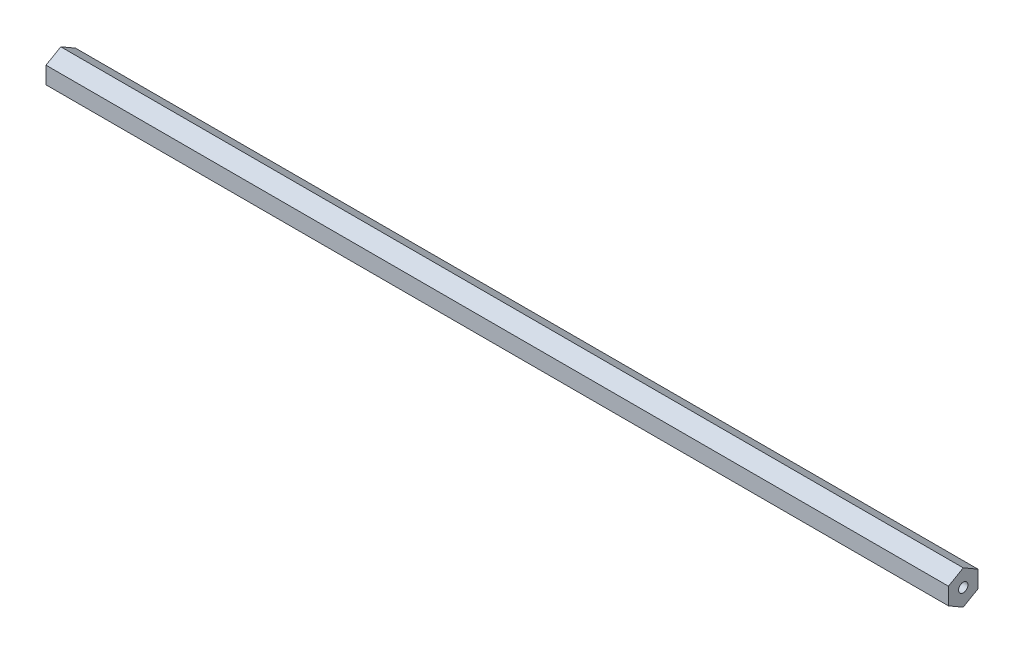
ISO-10303-21;
HEADER;
FILE_DESCRIPTION(('STEP AP214'),'2;1');
FILE_NAME('part.step','',(''),(''),'','','');
FILE_SCHEMA(('AUTOMOTIVE_DESIGN { 1 0 10303 214 1 1 1 1 }'));
ENDSEC;
DATA;
#1=APPLICATION_CONTEXT('core data for automotive mechanical design processes');
#2=APPLICATION_PROTOCOL_DEFINITION('international standard','automotive_design',2000,#1);
#3=PRODUCT_CONTEXT('',#1,'mechanical');
#4=PRODUCT('Part','Part','',(#3));
#5=PRODUCT_RELATED_PRODUCT_CATEGORY('part','',(#4));
#6=PRODUCT_DEFINITION_FORMATION('','',#4);
#7=PRODUCT_DEFINITION_CONTEXT('part definition',#1,'design');
#8=PRODUCT_DEFINITION('design','',#6,#7);
#9=PRODUCT_DEFINITION_SHAPE('','',#8);
#10=(LENGTH_UNIT() NAMED_UNIT(*) SI_UNIT(.MILLI.,.METRE.));
#11=(NAMED_UNIT(*) PLANE_ANGLE_UNIT() SI_UNIT($,.RADIAN.));
#12=(NAMED_UNIT(*) SI_UNIT($,.STERADIAN.) SOLID_ANGLE_UNIT());
#13=UNCERTAINTY_MEASURE_WITH_UNIT(LENGTH_MEASURE(1.E-05),#10,'distance_accuracy_value','');
#14=(GEOMETRIC_REPRESENTATION_CONTEXT(3) GLOBAL_UNCERTAINTY_ASSIGNED_CONTEXT((#13)) GLOBAL_UNIT_ASSIGNED_CONTEXT((#10,
#11,#12)) REPRESENTATION_CONTEXT('',''));
#15=CARTESIAN_POINT('',(0.,0.,0.));
#16=DIRECTION('',(0.,0.,1.));
#17=DIRECTION('',(1.,0.,0.));
#18=AXIS2_PLACEMENT_3D('',#15,#16,#17);
#19=CARTESIAN_POINT('',(194.071875,0.,-6.35));
#20=DIRECTION('',(0.,0.,1.));
#21=DIRECTION('',(0.,-1.,0.));
#22=AXIS2_PLACEMENT_3D('',#19,#20,#21);
#23=PLANE('',#22);
#24=DIRECTION('',(0.,1.,0.));
#25=VECTOR('',#24,1.);
#26=CARTESIAN_POINT('',(-194.071875,0.,-6.35));
#27=LINE('',#26,#25);
#28=CARTESIAN_POINT('',(-194.071875,-3.66617420935412,-6.35));
#29=VERTEX_POINT('',#28);
#30=CARTESIAN_POINT('',(-194.071875,3.66617420935413,-6.35));
#31=VERTEX_POINT('',#30);
#32=EDGE_CURVE('E134',#29,#31,#27,.T.);
#33=ORIENTED_EDGE('',*,*,#32,.T.);
#34=DIRECTION('',(-1.,0.,0.));
#35=VECTOR('',#34,1.);
#36=CARTESIAN_POINT('',(194.071875,3.66617420935413,-6.35));
#37=LINE('',#36,#35);
#38=CARTESIAN_POINT('',(194.071875,3.66617420935413,-6.35));
#39=VERTEX_POINT('',#38);
#40=EDGE_CURVE('E11',#39,#31,#37,.T.);
#41=ORIENTED_EDGE('',*,*,#40,.F.);
#42=DIRECTION('',(0.,1.,0.));
#43=VECTOR('',#42,1.);
#44=CARTESIAN_POINT('',(194.071875,0.,-6.35));
#45=LINE('',#44,#43);
#46=CARTESIAN_POINT('',(194.071875,-3.66617420935412,-6.35));
#47=VERTEX_POINT('',#46);
#48=EDGE_CURVE('E145',#47,#39,#45,.T.);
#49=ORIENTED_EDGE('',*,*,#48,.F.);
#50=DIRECTION('',(-1.,0.,0.));
#51=VECTOR('',#50,1.);
#52=CARTESIAN_POINT('',(194.071875,-3.66617420935412,-6.35));
#53=LINE('',#52,#51);
#54=EDGE_CURVE('E130',#47,#29,#53,.T.);
#55=ORIENTED_EDGE('',*,*,#54,.T.);
#56=EDGE_LOOP('',(#33,#41,#49,#55));
#57=FACE_BOUND('',#56,.T.);
#58=ADVANCED_FACE('F47',(#57),#23,.F.);
#59=CARTESIAN_POINT('',(194.071875,5.49926131403119,-3.175));
#60=DIRECTION('',(0.,-0.866025403784439,0.5));
#61=DIRECTION('',(0.,-0.5,-0.866025403784439));
#62=AXIS2_PLACEMENT_3D('',#59,#60,#61);
#63=PLANE('',#62);
#64=DIRECTION('',(0.,0.5,0.866025403784439));
#65=VECTOR('',#64,1.);
#66=CARTESIAN_POINT('',(-194.071875,5.49926131403119,-3.175));
#67=LINE('',#66,#65);
#68=CARTESIAN_POINT('',(-194.071875,7.33234841870825,0.));
#69=VERTEX_POINT('',#68);
#70=EDGE_CURVE('E137',#31,#69,#67,.T.);
#71=ORIENTED_EDGE('',*,*,#70,.T.);
#72=DIRECTION('',(-1.,0.,0.));
#73=VECTOR('',#72,1.);
#74=CARTESIAN_POINT('',(194.071875,7.33234841870825,0.));
#75=LINE('',#74,#73);
#76=CARTESIAN_POINT('',(194.071875,7.33234841870825,0.));
#77=VERTEX_POINT('',#76);
#78=EDGE_CURVE('E55',#77,#69,#75,.T.);
#79=ORIENTED_EDGE('',*,*,#78,.F.);
#80=DIRECTION('',(0.,0.5,0.866025403784439));
#81=VECTOR('',#80,1.);
#82=CARTESIAN_POINT('',(194.071875,5.49926131403119,-3.175));
#83=LINE('',#82,#81);
#84=EDGE_CURVE('E101',#39,#77,#83,.T.);
#85=ORIENTED_EDGE('',*,*,#84,.F.);
#86=ORIENTED_EDGE('',*,*,#40,.T.);
#87=EDGE_LOOP('',(#71,#79,#85,#86));
#88=FACE_BOUND('',#87,.T.);
#89=ADVANCED_FACE('F170',(#88),#63,.F.);
#90=CARTESIAN_POINT('',(194.071875,5.49926131403118,3.175));
#91=DIRECTION('',(0.,-0.866025403784438,-0.5));
#92=DIRECTION('',(0.,0.5,-0.866025403784439));
#93=AXIS2_PLACEMENT_3D('',#90,#91,#92);
#94=PLANE('',#93);
#95=DIRECTION('',(0.,-0.5,0.866025403784439));
#96=VECTOR('',#95,1.);
#97=CARTESIAN_POINT('',(-194.071875,5.49926131403118,3.175));
#98=LINE('',#97,#96);
#99=CARTESIAN_POINT('',(-194.071875,3.66617420935412,6.35));
#100=VERTEX_POINT('',#99);
#101=EDGE_CURVE('E140',#69,#100,#98,.T.);
#102=ORIENTED_EDGE('',*,*,#101,.T.);
#103=DIRECTION('',(-1.,0.,0.));
#104=VECTOR('',#103,1.);
#105=CARTESIAN_POINT('',(194.071875,3.66617420935412,6.35));
#106=LINE('',#105,#104);
#107=CARTESIAN_POINT('',(194.071875,3.66617420935412,6.35));
#108=VERTEX_POINT('',#107);
#109=EDGE_CURVE('E125',#108,#100,#106,.T.);
#110=ORIENTED_EDGE('',*,*,#109,.F.);
#111=DIRECTION('',(0.,-0.5,0.866025403784439));
#112=VECTOR('',#111,1.);
#113=CARTESIAN_POINT('',(194.071875,5.49926131403118,3.175));
#114=LINE('',#113,#112);
#115=EDGE_CURVE('E116',#77,#108,#114,.T.);
#116=ORIENTED_EDGE('',*,*,#115,.F.);
#117=ORIENTED_EDGE('',*,*,#78,.T.);
#118=EDGE_LOOP('',(#102,#110,#116,#117));
#119=FACE_BOUND('',#118,.T.);
#120=ADVANCED_FACE('F151',(#119),#94,.F.);
#121=CARTESIAN_POINT('',(194.071875,0.,6.35));
#122=DIRECTION('',(0.,0.,-1.));
#123=DIRECTION('',(0.,1.,0.));
#124=AXIS2_PLACEMENT_3D('',#121,#122,#123);
#125=PLANE('',#124);
#126=DIRECTION('',(0.,-1.,0.));
#127=VECTOR('',#126,1.);
#128=CARTESIAN_POINT('',(-194.071875,0.,6.35));
#129=LINE('',#128,#127);
#130=CARTESIAN_POINT('',(-194.071875,-3.66617420935413,6.35));
#131=VERTEX_POINT('',#130);
#132=EDGE_CURVE('E124',#100,#131,#129,.T.);
#133=ORIENTED_EDGE('',*,*,#132,.T.);
#134=DIRECTION('',(-1.,0.,0.));
#135=VECTOR('',#134,1.);
#136=CARTESIAN_POINT('',(194.071875,-3.66617420935413,6.35));
#137=LINE('',#136,#135);
#138=CARTESIAN_POINT('',(194.071875,-3.66617420935413,6.35));
#139=VERTEX_POINT('',#138);
#140=EDGE_CURVE('E121',#139,#131,#137,.T.);
#141=ORIENTED_EDGE('',*,*,#140,.F.);
#142=DIRECTION('',(0.,-1.,0.));
#143=VECTOR('',#142,1.);
#144=CARTESIAN_POINT('',(194.071875,0.,6.35));
#145=LINE('',#144,#143);
#146=EDGE_CURVE('E110',#108,#139,#145,.T.);
#147=ORIENTED_EDGE('',*,*,#146,.F.);
#148=ORIENTED_EDGE('',*,*,#109,.T.);
#149=EDGE_LOOP('',(#133,#141,#147,#148));
#150=FACE_BOUND('',#149,.T.);
#151=ADVANCED_FACE('F122',(#150),#125,.F.);
#152=CARTESIAN_POINT('',(194.071875,-5.49926131403119,3.175));
#153=DIRECTION('',(0.,0.866025403784439,-0.5));
#154=DIRECTION('',(0.,0.5,0.866025403784439));
#155=AXIS2_PLACEMENT_3D('',#152,#153,#154);
#156=PLANE('',#155);
#157=DIRECTION('',(0.,-0.5,-0.866025403784439));
#158=VECTOR('',#157,1.);
#159=CARTESIAN_POINT('',(-194.071875,-5.49926131403119,3.175));
#160=LINE('',#159,#158);
#161=CARTESIAN_POINT('',(-194.071875,-7.33234841870825,0.));
#162=VERTEX_POINT('',#161);
#163=EDGE_CURVE('E87',#131,#162,#160,.T.);
#164=ORIENTED_EDGE('',*,*,#163,.T.);
#165=DIRECTION('',(-1.,0.,0.));
#166=VECTOR('',#165,1.);
#167=CARTESIAN_POINT('',(194.071875,-7.33234841870825,0.));
#168=LINE('',#167,#166);
#169=CARTESIAN_POINT('',(194.071875,-7.33234841870825,0.));
#170=VERTEX_POINT('',#169);
#171=EDGE_CURVE('E126',#170,#162,#168,.T.);
#172=ORIENTED_EDGE('',*,*,#171,.F.);
#173=DIRECTION('',(0.,-0.5,-0.866025403784439));
#174=VECTOR('',#173,1.);
#175=CARTESIAN_POINT('',(194.071875,-5.49926131403119,3.175));
#176=LINE('',#175,#174);
#177=EDGE_CURVE('E114',#139,#170,#176,.T.);
#178=ORIENTED_EDGE('',*,*,#177,.F.);
#179=ORIENTED_EDGE('',*,*,#140,.T.);
#180=EDGE_LOOP('',(#164,#172,#178,#179));
#181=FACE_BOUND('',#180,.T.);
#182=ADVANCED_FACE('F128',(#181),#156,.F.);
#183=CARTESIAN_POINT('',(194.071875,-5.49926131403118,-3.175));
#184=DIRECTION('',(0.,0.866025403784439,0.5));
#185=DIRECTION('',(0.,-0.5,0.866025403784439));
#186=AXIS2_PLACEMENT_3D('',#183,#184,#185);
#187=PLANE('',#186);
#188=DIRECTION('',(0.,0.5,-0.866025403784439));
#189=VECTOR('',#188,1.);
#190=CARTESIAN_POINT('',(-194.071875,-5.49926131403118,-3.175));
#191=LINE('',#190,#189);
#192=EDGE_CURVE('E93',#162,#29,#191,.T.);
#193=ORIENTED_EDGE('',*,*,#192,.T.);
#194=ORIENTED_EDGE('',*,*,#54,.F.);
#195=DIRECTION('',(0.,0.5,-0.866025403784439));
#196=VECTOR('',#195,1.);
#197=CARTESIAN_POINT('',(194.071875,-5.49926131403118,-3.175));
#198=LINE('',#197,#196);
#199=EDGE_CURVE('E63',#170,#47,#198,.T.);
#200=ORIENTED_EDGE('',*,*,#199,.F.);
#201=ORIENTED_EDGE('',*,*,#171,.T.);
#202=EDGE_LOOP('',(#193,#194,#200,#201));
#203=FACE_BOUND('',#202,.T.);
#204=ADVANCED_FACE('F158',(#203),#187,.F.);
#205=CARTESIAN_POINT('',(194.071875,0.,0.));
#206=DIRECTION('',(1.,0.,0.));
#207=DIRECTION('',(0.,0.,-1.));
#208=AXIS2_PLACEMENT_3D('',#205,#206,#207);
#209=PLANE('',#208);
#210=CARTESIAN_POINT('',(194.071875,0.,0.));
#211=DIRECTION('',(1.,0.,0.));
#212=DIRECTION('',(0.,0.,-1.));
#213=AXIS2_PLACEMENT_3D('',#210,#211,#212);
#214=CIRCLE('',#213,2.01929999999999);
#215=CARTESIAN_POINT('',(194.071875,0.,-2.01929999999999));
#216=VERTEX_POINT('',#215);
#217=EDGE_CURVE('E314',#216,#216,#214,.T.);
#218=ORIENTED_EDGE('',*,*,#217,.F.);
#219=EDGE_LOOP('',(#218));
#220=FACE_BOUND('',#219,.T.);
#221=ORIENTED_EDGE('',*,*,#48,.T.);
#222=ORIENTED_EDGE('',*,*,#84,.T.);
#223=ORIENTED_EDGE('',*,*,#115,.T.);
#224=ORIENTED_EDGE('',*,*,#146,.T.);
#225=ORIENTED_EDGE('',*,*,#177,.T.);
#226=ORIENTED_EDGE('',*,*,#199,.T.);
#227=EDGE_LOOP('',(#221,#222,#223,#224,#225,#226));
#228=FACE_BOUND('',#227,.T.);
#229=ADVANCED_FACE('F112',(#220,#228),#209,.T.);
#230=CARTESIAN_POINT('',(-194.071875,0.,0.));
#231=DIRECTION('',(1.,0.,0.));
#232=DIRECTION('',(0.,0.,-1.));
#233=AXIS2_PLACEMENT_3D('',#230,#231,#232);
#234=PLANE('',#233);
#235=CARTESIAN_POINT('',(-194.071875,0.,0.));
#236=DIRECTION('',(-1.,0.,0.));
#237=DIRECTION('',(0.,0.,1.));
#238=AXIS2_PLACEMENT_3D('',#235,#236,#237);
#239=CIRCLE('',#238,2.01929999999999);
#240=CARTESIAN_POINT('',(-194.071875,0.,2.01929999999999));
#241=VERTEX_POINT('',#240);
#242=EDGE_CURVE('E316',#241,#241,#239,.T.);
#243=ORIENTED_EDGE('',*,*,#242,.F.);
#244=EDGE_LOOP('',(#243));
#245=FACE_BOUND('',#244,.T.);
#246=ORIENTED_EDGE('',*,*,#32,.F.);
#247=ORIENTED_EDGE('',*,*,#192,.F.);
#248=ORIENTED_EDGE('',*,*,#163,.F.);
#249=ORIENTED_EDGE('',*,*,#132,.F.);
#250=ORIENTED_EDGE('',*,*,#101,.F.);
#251=ORIENTED_EDGE('',*,*,#70,.F.);
#252=EDGE_LOOP('',(#246,#247,#248,#249,#250,#251));
#253=FACE_BOUND('',#252,.T.);
#254=ADVANCED_FACE('F154',(#245,#253),#234,.F.);
#255=CARTESIAN_POINT('',(-177.724435,0.,0.));
#256=DIRECTION('',(-1.,0.,0.));
#257=DIRECTION('',(0.,0.,1.));
#258=AXIS2_PLACEMENT_3D('',#255,#256,#257);
#259=CONICAL_SURFACE('',#258,2.01929999999999,1.02974425867665);
#260=CARTESIAN_POINT('',(-176.511117151998,0.,0.));
#261=VERTEX_POINT('',#260);
#262=VERTEX_LOOP('',#261);
#263=FACE_BOUND('',#262,.T.);
#264=CARTESIAN_POINT('',(-177.724435,0.,0.));
#265=DIRECTION('',(-1.,0.,0.));
#266=DIRECTION('',(0.,0.,1.));
#267=AXIS2_PLACEMENT_3D('',#264,#265,#266);
#268=CIRCLE('',#267,2.01929999999999);
#269=CARTESIAN_POINT('',(-177.724435,0.,2.01929999999999));
#270=VERTEX_POINT('',#269);
#271=EDGE_CURVE('E138',#270,#270,#268,.T.);
#272=ORIENTED_EDGE('',*,*,#271,.T.);
#273=EDGE_LOOP('',(#272));
#274=FACE_BOUND('',#273,.T.);
#275=ADVANCED_FACE('F214',(#263,#274),#259,.F.);
#276=CARTESIAN_POINT('',(-194.071875,0.,0.));
#277=DIRECTION('',(-1.,0.,0.));
#278=DIRECTION('',(0.,0.,1.));
#279=AXIS2_PLACEMENT_3D('',#276,#277,#278);
#280=CYLINDRICAL_SURFACE('',#279,2.01929999999999);
#281=ORIENTED_EDGE('',*,*,#271,.F.);
#282=EDGE_LOOP('',(#281));
#283=FACE_BOUND('',#282,.T.);
#284=ORIENTED_EDGE('',*,*,#242,.T.);
#285=EDGE_LOOP('',(#284));
#286=FACE_BOUND('',#285,.T.);
#287=ADVANCED_FACE('F226',(#283,#286),#280,.F.);
#288=CARTESIAN_POINT('',(177.724435,0.,0.));
#289=DIRECTION('',(1.,0.,0.));
#290=DIRECTION('',(0.,0.,-1.));
#291=AXIS2_PLACEMENT_3D('',#288,#289,#290);
#292=CONICAL_SURFACE('',#291,2.01929999999999,1.02974425867665);
#293=CARTESIAN_POINT('',(176.511117151998,0.,0.));
#294=VERTEX_POINT('',#293);
#295=VERTEX_LOOP('',#294);
#296=FACE_BOUND('',#295,.T.);
#297=CARTESIAN_POINT('',(177.724435,0.,0.));
#298=DIRECTION('',(1.,0.,0.));
#299=DIRECTION('',(0.,0.,-1.));
#300=AXIS2_PLACEMENT_3D('',#297,#298,#299);
#301=CIRCLE('',#300,2.01929999999999);
#302=CARTESIAN_POINT('',(177.724435,0.,-2.01929999999999));
#303=VERTEX_POINT('',#302);
#304=EDGE_CURVE('E311',#303,#303,#301,.T.);
#305=ORIENTED_EDGE('',*,*,#304,.T.);
#306=EDGE_LOOP('',(#305));
#307=FACE_BOUND('',#306,.T.);
#308=ADVANCED_FACE('F238',(#296,#307),#292,.F.);
#309=CARTESIAN_POINT('',(194.071875,0.,0.));
#310=DIRECTION('',(1.,0.,0.));
#311=DIRECTION('',(0.,0.,-1.));
#312=AXIS2_PLACEMENT_3D('',#309,#310,#311);
#313=CYLINDRICAL_SURFACE('',#312,2.01929999999999);
#314=ORIENTED_EDGE('',*,*,#304,.F.);
#315=EDGE_LOOP('',(#314));
#316=FACE_BOUND('',#315,.T.);
#317=ORIENTED_EDGE('',*,*,#217,.T.);
#318=EDGE_LOOP('',(#317));
#319=FACE_BOUND('',#318,.T.);
#320=ADVANCED_FACE('F251',(#316,#319),#313,.F.);
#321=CLOSED_SHELL('',(#58,#89,#120,#151,#182,#204,#229,#254,#275,#287,#308,#320));
#322=MANIFOLD_SOLID_BREP('B2',#321);
#323=ADVANCED_BREP_SHAPE_REPRESENTATION('',(#18,#322),#14);
#324=SHAPE_DEFINITION_REPRESENTATION(#9,#323);
ENDSEC;
END-ISO-10303-21;
